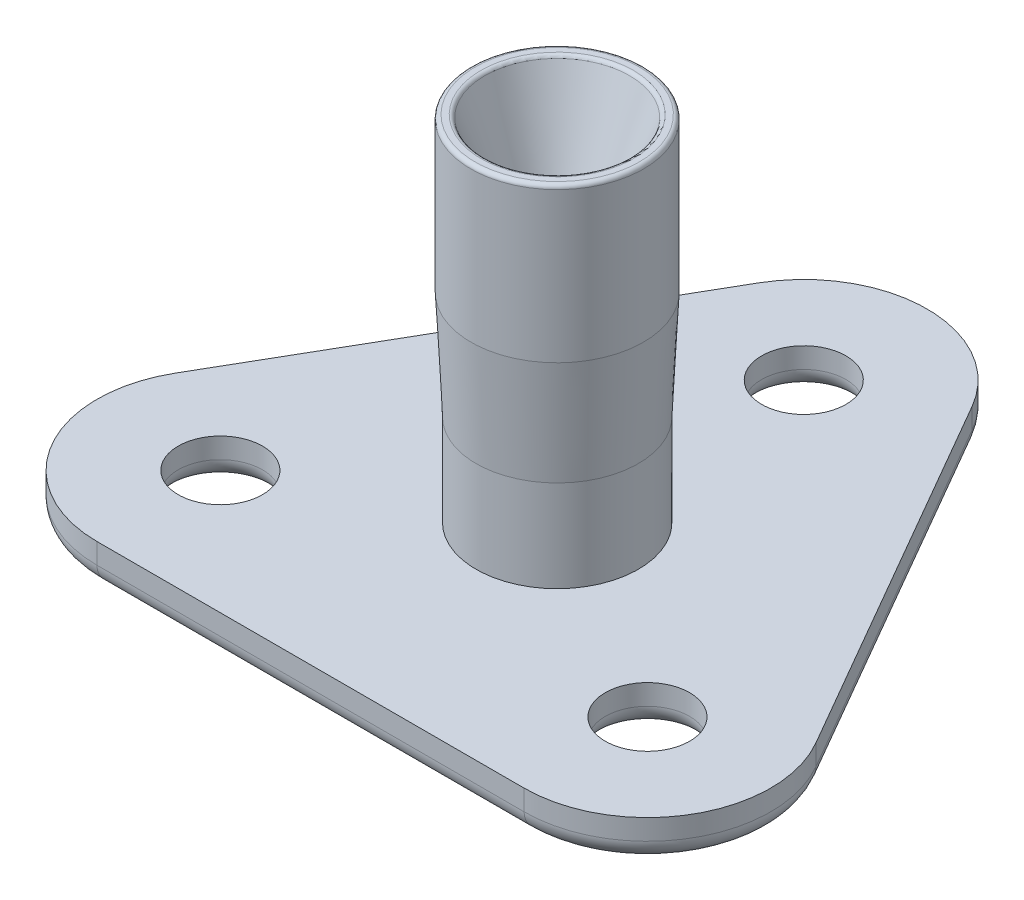
ISO-10303-21;
HEADER;
FILE_DESCRIPTION(('STEP AP214'),'2;1');
FILE_NAME('part.step','',(''),(''),'','','');
FILE_SCHEMA(('AUTOMOTIVE_DESIGN { 1 0 10303 214 1 1 1 1 }'));
ENDSEC;
DATA;
#1=APPLICATION_CONTEXT('core data for automotive mechanical design processes');
#2=APPLICATION_PROTOCOL_DEFINITION('international standard','automotive_design',2000,#1);
#3=PRODUCT_CONTEXT('',#1,'mechanical');
#4=PRODUCT('Part','Part','',(#3));
#5=PRODUCT_RELATED_PRODUCT_CATEGORY('part','',(#4));
#6=PRODUCT_DEFINITION_FORMATION('','',#4);
#7=PRODUCT_DEFINITION_CONTEXT('part definition',#1,'design');
#8=PRODUCT_DEFINITION('design','',#6,#7);
#9=PRODUCT_DEFINITION_SHAPE('','',#8);
#10=(LENGTH_UNIT() NAMED_UNIT(*) SI_UNIT(.MILLI.,.METRE.));
#11=(NAMED_UNIT(*) PLANE_ANGLE_UNIT() SI_UNIT($,.RADIAN.));
#12=(NAMED_UNIT(*) SI_UNIT($,.STERADIAN.) SOLID_ANGLE_UNIT());
#13=UNCERTAINTY_MEASURE_WITH_UNIT(LENGTH_MEASURE(1.E-05),#10,'distance_accuracy_value','');
#14=(GEOMETRIC_REPRESENTATION_CONTEXT(3) GLOBAL_UNCERTAINTY_ASSIGNED_CONTEXT((#13)) GLOBAL_UNIT_ASSIGNED_CONTEXT((#10,
#11,#12)) REPRESENTATION_CONTEXT('',''));
#15=CARTESIAN_POINT('',(0.,0.,0.));
#16=DIRECTION('',(0.,0.,1.));
#17=DIRECTION('',(1.,0.,0.));
#18=AXIS2_PLACEMENT_3D('',#15,#16,#17);
#19=CARTESIAN_POINT('',(0.,12.2419219804393,0.));
#20=DIRECTION('',(0.,1.,0.));
#21=DIRECTION('',(0.,0.,1.));
#22=AXIS2_PLACEMENT_3D('',#19,#20,#21);
#23=CONICAL_SURFACE('',#22,1.05,0.348575384764625);
#24=CARTESIAN_POINT('',(0.,19.0624665576369,0.));
#25=DIRECTION('',(0.,-1.,0.));
#26=DIRECTION('',(0.,0.,-1.));
#27=AXIS2_PLACEMENT_3D('',#24,#25,#26);
#28=CIRCLE('',#27,3.52868748193245);
#29=CARTESIAN_POINT('',(0.,19.0624665576369,3.52868748193245));
#30=VERTEX_POINT('',#29);
#31=EDGE_CURVE('E175',#30,#30,#28,.F.);
#32=CARTESIAN_POINT('',(0.,12.2419219804393,0.));
#33=DIRECTION('',(0.,-1.,0.));
#34=DIRECTION('',(0.,0.,-1.));
#35=AXIS2_PLACEMENT_3D('',#32,#33,#34);
#36=CIRCLE('',#35,1.05);
#37=CARTESIAN_POINT('',(0.,12.2419219804393,1.05));
#38=VERTEX_POINT('',#37);
#39=EDGE_CURVE('E154',#38,#38,#36,.T.);
#40=CARTESIAN_POINT('',(0.,19.0624665576369,3.52868748193245));
#41=CARTESIAN_POINT('',(0.,18.9914192182911,3.50286782066232));
#42=CARTESIAN_POINT('',(0.,18.9203718789453,3.47704815939219));
#43=CARTESIAN_POINT('',(0.,18.7782772002537,3.42540883685193));
#44=CARTESIAN_POINT('',(0.,18.7072298609079,3.3995891755818));
#45=CARTESIAN_POINT('',(0.,18.5651351822163,3.34794985304154));
#46=CARTESIAN_POINT('',(0.,18.4940878428705,3.32213019177141));
#47=CARTESIAN_POINT('',(0.,18.3519931641789,3.27049086923115));
#48=CARTESIAN_POINT('',(0.,18.280945824833,3.24467120796102));
#49=CARTESIAN_POINT('',(0.,18.1388511461414,3.19303188542076));
#50=CARTESIAN_POINT('',(0.,18.0678038067956,3.16721222415063));
#51=CARTESIAN_POINT('',(0.,17.925709128104,3.11557290161037));
#52=CARTESIAN_POINT('',(0.,17.8546617887582,3.08975324034024));
#53=CARTESIAN_POINT('',(0.,17.7125671100666,3.03811391779998));
#54=CARTESIAN_POINT('',(0.,17.6415197707208,3.01229425652986));
#55=CARTESIAN_POINT('',(0.,17.4994250920291,2.9606549339896));
#56=CARTESIAN_POINT('',(0.,17.4283777526833,2.93483527271947));
#57=CARTESIAN_POINT('',(0.,17.2862830739917,2.88319595017921));
#58=CARTESIAN_POINT('',(0.,17.2152357346459,2.85737628890908));
#59=CARTESIAN_POINT('',(0.,17.0731410559543,2.80573696636882));
#60=CARTESIAN_POINT('',(0.,17.0020937166085,2.77991730509869));
#61=CARTESIAN_POINT('',(0.,16.8599990379169,2.72827798255843));
#62=CARTESIAN_POINT('',(0.,16.788951698571,2.7024583212883));
#63=CARTESIAN_POINT('',(0.,16.6468570198794,2.65081899874804));
#64=CARTESIAN_POINT('',(0.,16.5758096805336,2.62499933747791));
#65=CARTESIAN_POINT('',(0.,16.433715001842,2.57336001493765));
#66=CARTESIAN_POINT('',(0.,16.3626676624962,2.54754035366752));
#67=CARTESIAN_POINT('',(0.,16.2205729838046,2.49590103112726));
#68=CARTESIAN_POINT('',(0.,16.1495256444588,2.47008136985713));
#69=CARTESIAN_POINT('',(0.,16.0074309657671,2.41844204731687));
#70=CARTESIAN_POINT('',(0.,15.9363836264213,2.39262238604674));
#71=CARTESIAN_POINT('',(0.,15.7942889477297,2.34098306350648));
#72=CARTESIAN_POINT('',(0.,15.7232416083839,2.31516340223635));
#73=CARTESIAN_POINT('',(0.,15.5811469296923,2.26352407969609));
#74=CARTESIAN_POINT('',(0.,15.5100995903465,2.23770441842597));
#75=CARTESIAN_POINT('',(0.,15.3680049116549,2.18606509588571));
#76=CARTESIAN_POINT('',(0.,15.2969575723091,2.16024543461558));
#77=CARTESIAN_POINT('',(0.,15.1548628936174,2.10860611207532));
#78=CARTESIAN_POINT('',(0.,15.0838155542716,2.08278645080519));
#79=CARTESIAN_POINT('',(0.,14.94172087558,2.03114712826493));
#80=CARTESIAN_POINT('',(0.,14.8706735362342,2.0053274669948));
#81=CARTESIAN_POINT('',(0.,14.7285788575426,1.95368814445454));
#82=CARTESIAN_POINT('',(0.,14.6575315181968,1.92786848318441));
#83=CARTESIAN_POINT('',(0.,14.5154368395052,1.87622916064415));
#84=CARTESIAN_POINT('',(0.,14.4443895001593,1.85040949937402));
#85=CARTESIAN_POINT('',(0.,14.3022948214677,1.79877017683376));
#86=CARTESIAN_POINT('',(0.,14.2312474821219,1.77295051556363));
#87=CARTESIAN_POINT('',(0.,14.0891528034303,1.72131119302337));
#88=CARTESIAN_POINT('',(0.,14.0181054640845,1.69549153175324));
#89=CARTESIAN_POINT('',(0.,13.8760107853929,1.64385220921298));
#90=CARTESIAN_POINT('',(0.,13.8049634460471,1.61803254794285));
#91=CARTESIAN_POINT('',(0.,13.6628687673554,1.56639322540259));
#92=CARTESIAN_POINT('',(0.,13.5918214280096,1.54057356413246));
#93=CARTESIAN_POINT('',(0.,13.449726749318,1.4889342415922));
#94=CARTESIAN_POINT('',(0.,13.3786794099722,1.46311458032208));
#95=CARTESIAN_POINT('',(0.,13.2365847312806,1.41147525778182));
#96=CARTESIAN_POINT('',(0.,13.1655373919348,1.38565559651169));
#97=CARTESIAN_POINT('',(0.,13.0234427132432,1.33401627397143));
#98=CARTESIAN_POINT('',(0.,12.9523953738973,1.3081966127013));
#99=CARTESIAN_POINT('',(0.,12.8103006952057,1.25655729016104));
#100=CARTESIAN_POINT('',(0.,12.7392533558599,1.23073762889091));
#101=CARTESIAN_POINT('',(0.,12.5971586771683,1.17909830635065));
#102=CARTESIAN_POINT('',(0.,12.5261113378225,1.15327864508052));
#103=CARTESIAN_POINT('',(0.,12.3840166591309,1.10163932254026));
#104=CARTESIAN_POINT('',(0.,12.3129693197851,1.07581966127013));
#105=CARTESIAN_POINT('',(0.,12.2419219804393,1.05));
#106=B_SPLINE_CURVE_WITH_KNOTS('',3,(#40,#41,#42,#43,#44,#45,#46,#47,#48,#49,#50,#51,#52,#53,
#54,#55,#56,#57,#58,#59,#60,#61,#62,#63,#64,#65,#66,#67,#68,#69,#70,#71,#72,#73,#74,#75,#76,#77,
#78,#79,#80,#81,#82,#83,#84,#85,#86,#87,#88,#89,#90,#91,#92,#93,#94,#95,#96,#97,#98,#99,#100,
#101,#102,#103,#104,#105),.UNSPECIFIED.,.F.,.F.,(4,2,2,2,2,2,2,2,2,2,2,2,2,2,2,2,2,2,2,2,2,2,2,
2,2,2,2,2,2,2,2,2,4),(0.,0.226780541550646,0.453561083101295,0.680341624651944,0.90712216620259,
1.13390270775324,1.36068324930389,1.58746379085454,1.81424433240519,2.04102487395583,
2.26780541550648,2.49458595705713,2.72136649860778,2.94814704015843,3.17492758170907,
3.40170812325972,3.62848866481037,3.85526920636102,4.08204974791167,4.30883028946232,
4.53561083101296,4.76239137256361,4.98917191411426,5.21595245566491,5.44273299721556,
5.66951353876621,5.89629408031685,6.1230746218675,6.34985516341815,6.5766357049688,
6.80341624651945,7.0301967880701,7.25697732962074),.UNSPECIFIED.);
#107=EDGE_CURVE('BSEAM35',#30,#38,#106,.T.);
#108=ORIENTED_EDGE('',*,*,#31,.T.);
#109=ORIENTED_EDGE('',*,*,#39,.T.);
#110=ORIENTED_EDGE('',*,*,#107,.T.);
#111=ORIENTED_EDGE('',*,*,#107,.F.);
#112=EDGE_LOOP('',(#108,#110,#109,#111));
#113=FACE_BOUND('',#112,.T.);
#114=ADVANCED_FACE('F35',(#113),#23,.F.);
#115=CARTESIAN_POINT('',(0.,19.1941547145831,0.));
#116=DIRECTION('',(0.,-1.,0.));
#117=DIRECTION('',(0.,0.,-1.));
#118=AXIS2_PLACEMENT_3D('',#115,#116,#117);
#119=PLANE('',#118);
#120=CARTESIAN_POINT('',(0.,19.1941547145831,0.));
#121=DIRECTION('',(0.,-1.,0.));
#122=DIRECTION('',(0.,0.,-1.));
#123=AXIS2_PLACEMENT_3D('',#120,#121,#122);
#124=CIRCLE('',#123,3.71665953330867);
#125=CARTESIAN_POINT('',(0.,19.1941547145831,-3.71665953330867));
#126=VERTEX_POINT('',#125);
#127=EDGE_CURVE('E172',#126,#126,#124,.T.);
#128=ORIENTED_EDGE('',*,*,#127,.T.);
#129=EDGE_LOOP('',(#128));
#130=FACE_BOUND('',#129,.T.);
#131=CARTESIAN_POINT('',(0.,19.1941547145831,0.));
#132=DIRECTION('',(0.,-1.,0.));
#133=DIRECTION('',(0.,0.,-1.));
#134=AXIS2_PLACEMENT_3D('',#131,#132,#133);
#135=CIRCLE('',#134,4.);
#136=CARTESIAN_POINT('',(0.,19.1941547145831,-4.));
#137=VERTEX_POINT('',#136);
#138=EDGE_CURVE('E169',#137,#137,#135,.F.);
#139=ORIENTED_EDGE('',*,*,#138,.T.);
#140=EDGE_LOOP('',(#139));
#141=FACE_BOUND('',#140,.T.);
#142=ADVANCED_FACE('F292',(#130,#141),#119,.F.);
#143=CARTESIAN_POINT('',(0.,0.,0.));
#144=DIRECTION('',(0.,-1.,0.));
#145=DIRECTION('',(0.,0.,-1.));
#146=AXIS2_PLACEMENT_3D('',#143,#144,#145);
#147=CYLINDRICAL_SURFACE('',#146,4.2);
#148=CARTESIAN_POINT('',(0.,18.9941547145831,0.));
#149=DIRECTION('',(0.,-1.,0.));
#150=DIRECTION('',(0.,0.,-1.));
#151=AXIS2_PLACEMENT_3D('',#148,#149,#150);
#152=CIRCLE('',#151,4.2);
#153=CARTESIAN_POINT('',(0.,18.9941547145831,-4.2));
#154=VERTEX_POINT('',#153);
#155=EDGE_CURVE('E178',#154,#154,#152,.T.);
#156=ORIENTED_EDGE('',*,*,#155,.T.);
#157=EDGE_LOOP('',(#156));
#158=FACE_BOUND('',#157,.T.);
#159=CARTESIAN_POINT('',(0.,11.6976685572823,0.));
#160=DIRECTION('',(0.,-1.,0.));
#161=DIRECTION('',(0.,0.,-1.));
#162=AXIS2_PLACEMENT_3D('',#159,#160,#161);
#163=CIRCLE('',#162,4.2);
#164=CARTESIAN_POINT('',(0.,11.6976685572823,-4.2));
#165=VERTEX_POINT('',#164);
#166=EDGE_CURVE('E166',#165,#165,#163,.T.);
#167=ORIENTED_EDGE('',*,*,#166,.F.);
#168=EDGE_LOOP('',(#167));
#169=FACE_BOUND('',#168,.T.);
#170=ADVANCED_FACE('F298',(#158,#169),#147,.T.);
#171=CARTESIAN_POINT('',(0.,11.6976685572823,0.));
#172=DIRECTION('',(0.,1.,0.));
#173=DIRECTION('',(0.,0.,1.));
#174=AXIS2_PLACEMENT_3D('',#171,#172,#173);
#175=CONICAL_SURFACE('',#174,4.2,0.0476505137092266);
#176=CARTESIAN_POINT('',(0.,6.45510688022455,0.));
#177=DIRECTION('',(0.,-1.,0.));
#178=DIRECTION('',(0.,0.,-1.));
#179=AXIS2_PLACEMENT_3D('',#176,#177,#178);
#180=CIRCLE('',#179,3.95);
#181=CARTESIAN_POINT('',(0.,6.45510688022455,-3.95));
#182=VERTEX_POINT('',#181);
#183=EDGE_CURVE('E163',#182,#182,#180,.T.);
#184=ORIENTED_EDGE('',*,*,#183,.F.);
#185=EDGE_LOOP('',(#184));
#186=FACE_BOUND('',#185,.T.);
#187=ORIENTED_EDGE('',*,*,#166,.T.);
#188=EDGE_LOOP('',(#187));
#189=FACE_BOUND('',#188,.T.);
#190=ADVANCED_FACE('F531',(#186,#189),#175,.T.);
#191=CARTESIAN_POINT('',(0.,0.,0.));
#192=DIRECTION('',(0.,-1.,0.));
#193=DIRECTION('',(0.,0.,-1.));
#194=AXIS2_PLACEMENT_3D('',#191,#192,#193);
#195=CYLINDRICAL_SURFACE('',#194,3.95);
#196=CARTESIAN_POINT('',(0.,2.,0.));
#197=DIRECTION('',(0.,-1.,0.));
#198=DIRECTION('',(0.,0.,-1.));
#199=AXIS2_PLACEMENT_3D('',#196,#197,#198);
#200=CIRCLE('',#199,3.95);
#201=CARTESIAN_POINT('',(0.,2.,-3.95));
#202=VERTEX_POINT('',#201);
#203=EDGE_CURVE('E160',#202,#202,#200,.T.);
#204=ORIENTED_EDGE('',*,*,#203,.F.);
#205=EDGE_LOOP('',(#204));
#206=FACE_BOUND('',#205,.T.);
#207=ORIENTED_EDGE('',*,*,#183,.T.);
#208=EDGE_LOOP('',(#207));
#209=FACE_BOUND('',#208,.T.);
#210=ADVANCED_FACE('F507',(#206,#209),#195,.T.);
#211=CARTESIAN_POINT('',(0.,2.,0.));
#212=DIRECTION('',(0.,-1.,0.));
#213=DIRECTION('',(0.,0.,-1.));
#214=AXIS2_PLACEMENT_3D('',#211,#212,#213);
#215=PLANE('',#214);
#216=ORIENTED_EDGE('',*,*,#203,.T.);
#217=EDGE_LOOP('',(#216));
#218=FACE_BOUND('',#217,.T.);
#219=CARTESIAN_POINT('',(10.3923048454133,2.,6.));
#220=DIRECTION('',(0.,-1.,0.));
#221=DIRECTION('',(0.,0.,-1.));
#222=AXIS2_PLACEMENT_3D('',#219,#220,#221);
#223=CIRCLE('',#222,2.05000000000005);
#224=CARTESIAN_POINT('',(10.3923048454133,2.,3.94999999999995));
#225=VERTEX_POINT('',#224);
#226=EDGE_CURVE('E269',#225,#225,#223,.T.);
#227=ORIENTED_EDGE('',*,*,#226,.T.);
#228=EDGE_LOOP('',(#227));
#229=FACE_BOUND('',#228,.T.);
#230=CARTESIAN_POINT('',(0.,2.,-12.));
#231=DIRECTION('',(0.,-1.,0.));
#232=DIRECTION('',(0.,0.,-1.));
#233=AXIS2_PLACEMENT_3D('',#230,#231,#232);
#234=CIRCLE('',#233,2.05);
#235=CARTESIAN_POINT('',(0.,2.,-14.05));
#236=VERTEX_POINT('',#235);
#237=EDGE_CURVE('E121',#236,#236,#234,.T.);
#238=ORIENTED_EDGE('',*,*,#237,.T.);
#239=EDGE_LOOP('',(#238));
#240=FACE_BOUND('',#239,.T.);
#241=DIRECTION('',(-0.500000000000005,0.,0.866025403784436));
#242=VECTOR('',#241,1.);
#243=CARTESIAN_POINT('',(-10.3923048454133,2.,-6.00000000000008));
#244=LINE('',#243,#242);
#245=CARTESIAN_POINT('',(-5.19615242270661,2.,-15.));
#246=VERTEX_POINT('',#245);
#247=CARTESIAN_POINT('',(-15.58845726812,2.,2.99999999999993));
#248=VERTEX_POINT('',#247);
#249=EDGE_CURVE('E110',#246,#248,#244,.T.);
#250=ORIENTED_EDGE('',*,*,#249,.T.);
#251=CARTESIAN_POINT('',(-10.3923048454133,2.,6.));
#252=DIRECTION('',(0.,-1.,0.));
#253=DIRECTION('',(0.,0.,-1.));
#254=AXIS2_PLACEMENT_3D('',#251,#252,#253);
#255=CIRCLE('',#254,6.00000000000011);
#256=CARTESIAN_POINT('',(-10.3923048454133,2.,12.));
#257=VERTEX_POINT('',#256);
#258=EDGE_CURVE('E115',#257,#248,#255,.T.);
#259=ORIENTED_EDGE('',*,*,#258,.F.);
#260=DIRECTION('',(-1.,0.,0.));
#261=VECTOR('',#260,1.);
#262=CARTESIAN_POINT('',(0.,2.,12.));
#263=LINE('',#262,#261);
#264=CARTESIAN_POINT('',(10.3923048454133,2.,12.0000000000001));
#265=VERTEX_POINT('',#264);
#266=EDGE_CURVE('E130',#265,#257,#263,.T.);
#267=ORIENTED_EDGE('',*,*,#266,.F.);
#268=CARTESIAN_POINT('',(10.3923048454133,2.,6.));
#269=DIRECTION('',(0.,-1.,0.));
#270=DIRECTION('',(0.,0.,-1.));
#271=AXIS2_PLACEMENT_3D('',#268,#269,#270);
#272=CIRCLE('',#271,6.00000000000005);
#273=CARTESIAN_POINT('',(15.5884572681199,2.,2.99999999999997));
#274=VERTEX_POINT('',#273);
#275=EDGE_CURVE('E142',#274,#265,#272,.T.);
#276=ORIENTED_EDGE('',*,*,#275,.F.);
#277=DIRECTION('',(0.500000000000002,0.,0.866025403784438));
#278=VECTOR('',#277,1.);
#279=CARTESIAN_POINT('',(10.3923048454133,2.,-6.00000000000003));
#280=LINE('',#279,#278);
#281=CARTESIAN_POINT('',(5.19615242270662,2.,-15.));
#282=VERTEX_POINT('',#281);
#283=EDGE_CURVE('E146',#282,#274,#280,.T.);
#284=ORIENTED_EDGE('',*,*,#283,.F.);
#285=CARTESIAN_POINT('',(0.,2.,-12.));
#286=DIRECTION('',(0.,-1.,0.));
#287=DIRECTION('',(0.,0.,-1.));
#288=AXIS2_PLACEMENT_3D('',#285,#286,#287);
#289=CIRCLE('',#288,6.);
#290=EDGE_CURVE('E118',#246,#282,#289,.T.);
#291=ORIENTED_EDGE('',*,*,#290,.F.);
#292=EDGE_LOOP('',(#250,#259,#267,#276,#284,#291));
#293=FACE_BOUND('',#292,.T.);
#294=CARTESIAN_POINT('',(-10.3923048454133,2.,6.));
#295=DIRECTION('',(0.,-1.,0.));
#296=DIRECTION('',(0.,0.,-1.));
#297=AXIS2_PLACEMENT_3D('',#294,#295,#296);
#298=CIRCLE('',#297,2.0500000000001);
#299=CARTESIAN_POINT('',(-10.3923048454133,2.,3.9499999999999));
#300=VERTEX_POINT('',#299);
#301=EDGE_CURVE('E120',#300,#300,#298,.T.);
#302=ORIENTED_EDGE('',*,*,#301,.T.);
#303=EDGE_LOOP('',(#302));
#304=FACE_BOUND('',#303,.T.);
#305=ADVANCED_FACE('F112',(#218,#229,#240,#293,#304),#215,.F.);
#306=CARTESIAN_POINT('',(0.,0.,0.));
#307=DIRECTION('',(0.,1.,0.));
#308=DIRECTION('',(0.,0.,1.));
#309=AXIS2_PLACEMENT_3D('',#306,#307,#308);
#310=PLANE('',#309);
#311=CARTESIAN_POINT('',(-10.3923048454133,0.,6.));
#312=DIRECTION('',(0.,1.,0.));
#313=DIRECTION('',(0.,0.,1.));
#314=AXIS2_PLACEMENT_3D('',#311,#312,#313);
#315=CIRCLE('',#314,3.0500000000001);
#316=CARTESIAN_POINT('',(-10.3923048454133,0.,9.05000000000011));
#317=VERTEX_POINT('',#316);
#318=EDGE_CURVE('E203',#317,#317,#315,.T.);
#319=ORIENTED_EDGE('',*,*,#318,.T.);
#320=EDGE_LOOP('',(#319));
#321=FACE_BOUND('',#320,.T.);
#322=CARTESIAN_POINT('',(10.3923048454133,0.,6.));
#323=DIRECTION('',(0.,1.,0.));
#324=DIRECTION('',(0.,0.,1.));
#325=AXIS2_PLACEMENT_3D('',#322,#323,#324);
#326=CIRCLE('',#325,3.05000000000005);
#327=CARTESIAN_POINT('',(10.3923048454133,0.,9.05000000000005));
#328=VERTEX_POINT('',#327);
#329=EDGE_CURVE('E200',#328,#328,#326,.T.);
#330=ORIENTED_EDGE('',*,*,#329,.T.);
#331=EDGE_LOOP('',(#330));
#332=FACE_BOUND('',#331,.T.);
#333=CARTESIAN_POINT('',(0.,0.,-12.));
#334=DIRECTION('',(0.,1.,0.));
#335=DIRECTION('',(0.,0.,1.));
#336=AXIS2_PLACEMENT_3D('',#333,#334,#335);
#337=CIRCLE('',#336,3.05);
#338=CARTESIAN_POINT('',(0.,0.,-8.95));
#339=VERTEX_POINT('',#338);
#340=EDGE_CURVE('E197',#339,#339,#337,.T.);
#341=ORIENTED_EDGE('',*,*,#340,.T.);
#342=EDGE_LOOP('',(#341));
#343=FACE_BOUND('',#342,.T.);
#344=DIRECTION('',(1.,0.,0.));
#345=VECTOR('',#344,1.);
#346=CARTESIAN_POINT('',(0.,0.,11.));
#347=LINE('',#346,#345);
#348=CARTESIAN_POINT('',(10.3923048454133,0.,11.0000000000001));
#349=VERTEX_POINT('',#348);
#350=CARTESIAN_POINT('',(-10.3923048454133,0.,11.));
#351=VERTEX_POINT('',#350);
#352=EDGE_CURVE('E192',#349,#351,#347,.F.);
#353=ORIENTED_EDGE('',*,*,#352,.T.);
#354=CARTESIAN_POINT('',(-10.3923048454133,0.,6.));
#355=DIRECTION('',(0.,1.,0.));
#356=DIRECTION('',(0.,0.,1.));
#357=AXIS2_PLACEMENT_3D('',#354,#355,#356);
#358=CIRCLE('',#357,5.00000000000011);
#359=CARTESIAN_POINT('',(-14.7224318643355,0.,3.49999999999993));
#360=VERTEX_POINT('',#359);
#361=EDGE_CURVE('E194',#351,#360,#358,.F.);
#362=ORIENTED_EDGE('',*,*,#361,.T.);
#363=DIRECTION('',(0.500000000000005,0.,-0.866025403784436));
#364=VECTOR('',#363,1.);
#365=CARTESIAN_POINT('',(-4.33012701892218,0.,-14.5));
#366=LINE('',#365,#364);
#367=CARTESIAN_POINT('',(-4.33012701892218,0.,-14.5));
#368=VERTEX_POINT('',#367);
#369=EDGE_CURVE('E184',#360,#368,#366,.T.);
#370=ORIENTED_EDGE('',*,*,#369,.T.);
#371=CARTESIAN_POINT('',(0.,0.,-12.));
#372=DIRECTION('',(0.,1.,0.));
#373=DIRECTION('',(0.,0.,1.));
#374=AXIS2_PLACEMENT_3D('',#371,#372,#373);
#375=CIRCLE('',#374,5.);
#376=CARTESIAN_POINT('',(4.33012701892219,0.,-14.5));
#377=VERTEX_POINT('',#376);
#378=EDGE_CURVE('E186',#368,#377,#375,.F.);
#379=ORIENTED_EDGE('',*,*,#378,.T.);
#380=DIRECTION('',(-0.500000000000002,0.,-0.866025403784438));
#381=VECTOR('',#380,1.);
#382=CARTESIAN_POINT('',(9.52627944162883,0.,-5.50000000000003));
#383=LINE('',#382,#381);
#384=CARTESIAN_POINT('',(14.7224318643355,0.,3.49999999999997));
#385=VERTEX_POINT('',#384);
#386=EDGE_CURVE('E188',#377,#385,#383,.F.);
#387=ORIENTED_EDGE('',*,*,#386,.T.);
#388=CARTESIAN_POINT('',(10.3923048454133,0.,6.));
#389=DIRECTION('',(0.,1.,0.));
#390=DIRECTION('',(0.,0.,1.));
#391=AXIS2_PLACEMENT_3D('',#388,#389,#390);
#392=CIRCLE('',#391,5.00000000000005);
#393=EDGE_CURVE('E190',#385,#349,#392,.F.);
#394=ORIENTED_EDGE('',*,*,#393,.T.);
#395=EDGE_LOOP('',(#353,#362,#370,#379,#387,#394));
#396=FACE_BOUND('',#395,.T.);
#397=CARTESIAN_POINT('',(0.,0.,0.));
#398=DIRECTION('',(0.,1.,0.));
#399=DIRECTION('',(0.,0.,1.));
#400=AXIS2_PLACEMENT_3D('',#397,#398,#399);
#401=CIRCLE('',#400,3.25981112563822);
#402=CARTESIAN_POINT('',(0.,0.,3.25981112563822));
#403=VERTEX_POINT('',#402);
#404=EDGE_CURVE('E181',#403,#403,#401,.T.);
#405=ORIENTED_EDGE('',*,*,#404,.T.);
#406=EDGE_LOOP('',(#405));
#407=FACE_BOUND('',#406,.T.);
#408=ADVANCED_FACE('F249',(#321,#332,#343,#396,#407),#310,.F.);
#409=CARTESIAN_POINT('',(0.,0.,0.));
#410=DIRECTION('',(0.,-1.,0.));
#411=DIRECTION('',(0.,0.,-1.));
#412=AXIS2_PLACEMENT_3D('',#409,#410,#411);
#413=CONICAL_SURFACE('',#412,2.8072837632777,0.72088893930575);
#414=CARTESIAN_POINT('',(0.,0.339947278980805,0.));
#415=DIRECTION('',(0.,1.,0.));
#416=DIRECTION('',(0.,0.,1.));
#417=AXIS2_PLACEMENT_3D('',#414,#415,#416);
#418=CIRCLE('',#417,2.508591846416);
#419=CARTESIAN_POINT('',(0.,0.339947278980805,2.508591846416));
#420=VERTEX_POINT('',#419);
#421=EDGE_CURVE('E11',#420,#420,#418,.F.);
#422=ORIENTED_EDGE('',*,*,#421,.T.);
#423=EDGE_LOOP('',(#422));
#424=FACE_BOUND('',#423,.T.);
#425=CARTESIAN_POINT('',(0.,2.,0.));
#426=DIRECTION('',(0.,-1.,0.));
#427=DIRECTION('',(0.,0.,-1.));
#428=AXIS2_PLACEMENT_3D('',#425,#426,#427);
#429=CIRCLE('',#428,1.05);
#430=CARTESIAN_POINT('',(0.,2.,-1.05));
#431=VERTEX_POINT('',#430);
#432=EDGE_CURVE('E157',#431,#431,#429,.T.);
#433=ORIENTED_EDGE('',*,*,#432,.F.);
#434=EDGE_LOOP('',(#433));
#435=FACE_BOUND('',#434,.T.);
#436=ADVANCED_FACE('F475',(#424,#435),#413,.F.);
#437=CARTESIAN_POINT('',(0.,0.,0.));
#438=DIRECTION('',(0.,-1.,0.));
#439=DIRECTION('',(0.,0.,-1.));
#440=AXIS2_PLACEMENT_3D('',#437,#438,#439);
#441=CYLINDRICAL_SURFACE('',#440,1.05);
#442=ORIENTED_EDGE('',*,*,#39,.F.);
#443=EDGE_LOOP('',(#442));
#444=FACE_BOUND('',#443,.T.);
#445=ORIENTED_EDGE('',*,*,#432,.T.);
#446=EDGE_LOOP('',(#445));
#447=FACE_BOUND('',#446,.T.);
#448=ADVANCED_FACE('F467',(#444,#447),#441,.F.);
#449=CARTESIAN_POINT('',(-10.3923048454133,46.4390665133715,-6.00000000000008));
#450=DIRECTION('',(-0.866025403784436,0.,-0.500000000000004));
#451=DIRECTION('',(-0.500000000000005,0.,0.866025403784436));
#452=AXIS2_PLACEMENT_3D('',#449,#450,#451);
#453=PLANE('',#452);
#454=DIRECTION('',(0.,-1.,0.));
#455=VECTOR('',#454,1.);
#456=CARTESIAN_POINT('',(-5.19615242270662,46.4390665133715,-15.));
#457=LINE('',#456,#455);
#458=CARTESIAN_POINT('',(-5.19615242270662,1.,-15.));
#459=VERTEX_POINT('',#458);
#460=EDGE_CURVE('E136',#246,#459,#457,.T.);
#461=ORIENTED_EDGE('',*,*,#460,.T.);
#462=DIRECTION('',(0.500000000000005,0.,-0.866025403784436));
#463=VECTOR('',#462,1.);
#464=CARTESIAN_POINT('',(-15.58845726812,1.,2.99999999999993));
#465=LINE('',#464,#463);
#466=CARTESIAN_POINT('',(-15.58845726812,1.,2.99999999999993));
#467=VERTEX_POINT('',#466);
#468=EDGE_CURVE('E44',#459,#467,#465,.F.);
#469=ORIENTED_EDGE('',*,*,#468,.T.);
#470=DIRECTION('',(0.,-1.,0.));
#471=VECTOR('',#470,1.);
#472=CARTESIAN_POINT('',(-15.58845726812,46.4390665133715,2.99999999999993));
#473=LINE('',#472,#471);
#474=EDGE_CURVE('E124',#248,#467,#473,.T.);
#475=ORIENTED_EDGE('',*,*,#474,.F.);
#476=ORIENTED_EDGE('',*,*,#249,.F.);
#477=EDGE_LOOP('',(#461,#469,#475,#476));
#478=FACE_BOUND('',#477,.T.);
#479=ADVANCED_FACE('F125',(#478),#453,.T.);
#480=CARTESIAN_POINT('',(-10.3923048454133,46.4390665133715,6.));
#481=DIRECTION('',(0.,-1.,0.));
#482=DIRECTION('',(0.,0.,-1.));
#483=AXIS2_PLACEMENT_3D('',#480,#481,#482);
#484=CYLINDRICAL_SURFACE('',#483,6.00000000000011);
#485=ORIENTED_EDGE('',*,*,#474,.T.);
#486=CARTESIAN_POINT('',(-10.3923048454133,1.,6.));
#487=DIRECTION('',(0.,1.,0.));
#488=DIRECTION('',(0.,0.,1.));
#489=AXIS2_PLACEMENT_3D('',#486,#487,#488);
#490=CIRCLE('',#489,6.00000000000011);
#491=CARTESIAN_POINT('',(-10.3923048454133,1.,12.0000000000001));
#492=VERTEX_POINT('',#491);
#493=EDGE_CURVE('E215',#467,#492,#490,.T.);
#494=ORIENTED_EDGE('',*,*,#493,.T.);
#495=DIRECTION('',(0.,-1.,0.));
#496=VECTOR('',#495,1.);
#497=CARTESIAN_POINT('',(-10.3923048454133,46.4390665133715,12.0000000000001));
#498=LINE('',#497,#496);
#499=EDGE_CURVE('E134',#257,#492,#498,.T.);
#500=ORIENTED_EDGE('',*,*,#499,.F.);
#501=ORIENTED_EDGE('',*,*,#258,.T.);
#502=EDGE_LOOP('',(#485,#494,#500,#501));
#503=FACE_BOUND('',#502,.T.);
#504=ADVANCED_FACE('F132',(#503),#484,.T.);
#505=CARTESIAN_POINT('',(0.,46.4390665133715,12.));
#506=DIRECTION('',(0.,0.,-1.));
#507=DIRECTION('',(-1.,0.,0.));
#508=AXIS2_PLACEMENT_3D('',#505,#506,#507);
#509=PLANE('',#508);
#510=ORIENTED_EDGE('',*,*,#499,.T.);
#511=DIRECTION('',(1.,0.,0.));
#512=VECTOR('',#511,1.);
#513=CARTESIAN_POINT('',(0.,1.,12.));
#514=LINE('',#513,#512);
#515=CARTESIAN_POINT('',(10.3923048454133,1.,12.));
#516=VERTEX_POINT('',#515);
#517=EDGE_CURVE('E217',#492,#516,#514,.T.);
#518=ORIENTED_EDGE('',*,*,#517,.T.);
#519=DIRECTION('',(0.,-1.,0.));
#520=VECTOR('',#519,1.);
#521=CARTESIAN_POINT('',(10.3923048454133,46.4390665133715,12.));
#522=LINE('',#521,#520);
#523=EDGE_CURVE('E145',#265,#516,#522,.T.);
#524=ORIENTED_EDGE('',*,*,#523,.F.);
#525=ORIENTED_EDGE('',*,*,#266,.T.);
#526=EDGE_LOOP('',(#510,#518,#524,#525));
#527=FACE_BOUND('',#526,.T.);
#528=ADVANCED_FACE('F262',(#527),#509,.F.);
#529=CARTESIAN_POINT('',(10.3923048454133,46.4390665133715,6.));
#530=DIRECTION('',(0.,-1.,0.));
#531=DIRECTION('',(0.,0.,-1.));
#532=AXIS2_PLACEMENT_3D('',#529,#530,#531);
#533=CYLINDRICAL_SURFACE('',#532,6.00000000000005);
#534=ORIENTED_EDGE('',*,*,#523,.T.);
#535=CARTESIAN_POINT('',(10.3923048454133,1.,6.));
#536=DIRECTION('',(0.,1.,0.));
#537=DIRECTION('',(0.,0.,1.));
#538=AXIS2_PLACEMENT_3D('',#535,#536,#537);
#539=CIRCLE('',#538,6.00000000000005);
#540=CARTESIAN_POINT('',(15.5884572681199,1.,2.99999999999997));
#541=VERTEX_POINT('',#540);
#542=EDGE_CURVE('E219',#516,#541,#539,.T.);
#543=ORIENTED_EDGE('',*,*,#542,.T.);
#544=DIRECTION('',(0.,-1.,0.));
#545=VECTOR('',#544,1.);
#546=CARTESIAN_POINT('',(15.5884572681199,46.4390665133715,2.99999999999997));
#547=LINE('',#546,#545);
#548=EDGE_CURVE('E149',#274,#541,#547,.T.);
#549=ORIENTED_EDGE('',*,*,#548,.F.);
#550=ORIENTED_EDGE('',*,*,#275,.T.);
#551=EDGE_LOOP('',(#534,#543,#549,#550));
#552=FACE_BOUND('',#551,.T.);
#553=ADVANCED_FACE('F437',(#552),#533,.T.);
#554=CARTESIAN_POINT('',(10.3923048454133,46.4390665133715,-6.00000000000003));
#555=DIRECTION('',(-0.866025403784438,0.,0.500000000000002));
#556=DIRECTION('',(0.500000000000002,0.,0.866025403784438));
#557=AXIS2_PLACEMENT_3D('',#554,#555,#556);
#558=PLANE('',#557);
#559=ORIENTED_EDGE('',*,*,#548,.T.);
#560=DIRECTION('',(-0.500000000000002,0.,-0.866025403784438));
#561=VECTOR('',#560,1.);
#562=CARTESIAN_POINT('',(10.3923048454133,1.,-6.00000000000003));
#563=LINE('',#562,#561);
#564=CARTESIAN_POINT('',(5.19615242270662,1.,-15.));
#565=VERTEX_POINT('',#564);
#566=EDGE_CURVE('E60',#541,#565,#563,.T.);
#567=ORIENTED_EDGE('',*,*,#566,.T.);
#568=DIRECTION('',(0.,-1.,0.));
#569=VECTOR('',#568,1.);
#570=CARTESIAN_POINT('',(5.19615242270662,46.4390665133715,-15.));
#571=LINE('',#570,#569);
#572=EDGE_CURVE('E151',#282,#565,#571,.T.);
#573=ORIENTED_EDGE('',*,*,#572,.F.);
#574=ORIENTED_EDGE('',*,*,#283,.T.);
#575=EDGE_LOOP('',(#559,#567,#573,#574));
#576=FACE_BOUND('',#575,.T.);
#577=ADVANCED_FACE('F288',(#576),#558,.F.);
#578=CARTESIAN_POINT('',(10.3923048454133,46.4390665133715,6.));
#579=DIRECTION('',(0.,-1.,0.));
#580=DIRECTION('',(0.,0.,-1.));
#581=AXIS2_PLACEMENT_3D('',#578,#579,#580);
#582=CYLINDRICAL_SURFACE('',#581,2.05000000000005);
#583=CARTESIAN_POINT('',(10.3923048454133,1.,6.));
#584=DIRECTION('',(0.,1.,0.));
#585=DIRECTION('',(0.,0.,1.));
#586=AXIS2_PLACEMENT_3D('',#583,#584,#585);
#587=CIRCLE('',#586,2.05000000000005);
#588=CARTESIAN_POINT('',(10.3923048454133,1.,8.05000000000005));
#589=VERTEX_POINT('',#588);
#590=EDGE_CURVE('E209',#589,#589,#587,.F.);
#591=ORIENTED_EDGE('',*,*,#590,.T.);
#592=EDGE_LOOP('',(#591));
#593=FACE_BOUND('',#592,.T.);
#594=ORIENTED_EDGE('',*,*,#226,.F.);
#595=EDGE_LOOP('',(#594));
#596=FACE_BOUND('',#595,.T.);
#597=ADVANCED_FACE('F279',(#593,#596),#582,.F.);
#598=CARTESIAN_POINT('',(0.,46.4390665133715,-12.));
#599=DIRECTION('',(0.,-1.,0.));
#600=DIRECTION('',(0.,0.,-1.));
#601=AXIS2_PLACEMENT_3D('',#598,#599,#600);
#602=CYLINDRICAL_SURFACE('',#601,2.05);
#603=CARTESIAN_POINT('',(0.,1.,-12.));
#604=DIRECTION('',(0.,1.,0.));
#605=DIRECTION('',(0.,0.,1.));
#606=AXIS2_PLACEMENT_3D('',#603,#604,#605);
#607=CIRCLE('',#606,2.05);
#608=CARTESIAN_POINT('',(0.,1.,-9.95));
#609=VERTEX_POINT('',#608);
#610=EDGE_CURVE('E212',#609,#609,#607,.F.);
#611=ORIENTED_EDGE('',*,*,#610,.T.);
#612=EDGE_LOOP('',(#611));
#613=FACE_BOUND('',#612,.T.);
#614=ORIENTED_EDGE('',*,*,#237,.F.);
#615=EDGE_LOOP('',(#614));
#616=FACE_BOUND('',#615,.T.);
#617=ADVANCED_FACE('F276',(#613,#616),#602,.F.);
#618=CARTESIAN_POINT('',(0.,46.4390665133715,-12.));
#619=DIRECTION('',(0.,-1.,0.));
#620=DIRECTION('',(0.,0.,-1.));
#621=AXIS2_PLACEMENT_3D('',#618,#619,#620);
#622=CYLINDRICAL_SURFACE('',#621,6.);
#623=ORIENTED_EDGE('',*,*,#572,.T.);
#624=CARTESIAN_POINT('',(0.,1.,-12.));
#625=DIRECTION('',(0.,1.,0.));
#626=DIRECTION('',(0.,0.,1.));
#627=AXIS2_PLACEMENT_3D('',#624,#625,#626);
#628=CIRCLE('',#627,6.);
#629=EDGE_CURVE('E52',#565,#459,#628,.T.);
#630=ORIENTED_EDGE('',*,*,#629,.T.);
#631=ORIENTED_EDGE('',*,*,#460,.F.);
#632=ORIENTED_EDGE('',*,*,#290,.T.);
#633=EDGE_LOOP('',(#623,#630,#631,#632));
#634=FACE_BOUND('',#633,.T.);
#635=ADVANCED_FACE('F278',(#634),#622,.T.);
#636=CARTESIAN_POINT('',(-10.3923048454133,46.4390665133715,6.));
#637=DIRECTION('',(0.,-1.,0.));
#638=DIRECTION('',(0.,0.,-1.));
#639=AXIS2_PLACEMENT_3D('',#636,#637,#638);
#640=CYLINDRICAL_SURFACE('',#639,2.0500000000001);
#641=CARTESIAN_POINT('',(-10.3923048454133,1.,6.));
#642=DIRECTION('',(0.,1.,0.));
#643=DIRECTION('',(0.,0.,1.));
#644=AXIS2_PLACEMENT_3D('',#641,#642,#643);
#645=CIRCLE('',#644,2.0500000000001);
#646=CARTESIAN_POINT('',(-10.3923048454133,1.,8.05000000000011));
#647=VERTEX_POINT('',#646);
#648=EDGE_CURVE('E206',#647,#647,#645,.F.);
#649=ORIENTED_EDGE('',*,*,#648,.T.);
#650=EDGE_LOOP('',(#649));
#651=FACE_BOUND('',#650,.T.);
#652=ORIENTED_EDGE('',*,*,#301,.F.);
#653=EDGE_LOOP('',(#652));
#654=FACE_BOUND('',#653,.T.);
#655=ADVANCED_FACE('F286',(#651,#654),#640,.F.);
#656=CARTESIAN_POINT('',(0.,18.9941547145831,0.));
#657=DIRECTION('',(0.,-1.,0.));
#658=DIRECTION('',(0.,0.,-1.));
#659=AXIS2_PLACEMENT_3D('',#656,#657,#658);
#660=TOROIDAL_SURFACE('',#659,3.71665953330867,0.2);
#661=ORIENTED_EDGE('',*,*,#31,.F.);
#662=EDGE_LOOP('',(#661));
#663=FACE_BOUND('',#662,.T.);
#664=ORIENTED_EDGE('',*,*,#127,.F.);
#665=EDGE_LOOP('',(#664));
#666=FACE_BOUND('',#665,.T.);
#667=ADVANCED_FACE('F304',(#663,#666),#660,.T.);
#668=CARTESIAN_POINT('',(0.,18.9941547145831,0.));
#669=DIRECTION('',(0.,-1.,0.));
#670=DIRECTION('',(0.,0.,-1.));
#671=AXIS2_PLACEMENT_3D('',#668,#669,#670);
#672=TOROIDAL_SURFACE('',#671,4.,0.2);
#673=ORIENTED_EDGE('',*,*,#138,.F.);
#674=EDGE_LOOP('',(#673));
#675=FACE_BOUND('',#674,.T.);
#676=ORIENTED_EDGE('',*,*,#155,.F.);
#677=EDGE_LOOP('',(#676));
#678=FACE_BOUND('',#677,.T.);
#679=ADVANCED_FACE('F307',(#675,#678),#672,.T.);
#680=CARTESIAN_POINT('',(-10.3923048454133,1.,6.));
#681=DIRECTION('',(0.,1.,0.));
#682=DIRECTION('',(0.,0.,1.));
#683=AXIS2_PLACEMENT_3D('',#680,#681,#682);
#684=TOROIDAL_SURFACE('',#683,3.0500000000001,1.);
#685=ORIENTED_EDGE('',*,*,#648,.F.);
#686=EDGE_LOOP('',(#685));
#687=FACE_BOUND('',#686,.T.);
#688=ORIENTED_EDGE('',*,*,#318,.F.);
#689=EDGE_LOOP('',(#688));
#690=FACE_BOUND('',#689,.T.);
#691=ADVANCED_FACE('F311',(#687,#690),#684,.T.);
#692=CARTESIAN_POINT('',(10.3923048454133,1.,6.));
#693=DIRECTION('',(0.,1.,0.));
#694=DIRECTION('',(0.,0.,1.));
#695=AXIS2_PLACEMENT_3D('',#692,#693,#694);
#696=TOROIDAL_SURFACE('',#695,3.05000000000005,1.);
#697=ORIENTED_EDGE('',*,*,#590,.F.);
#698=EDGE_LOOP('',(#697));
#699=FACE_BOUND('',#698,.T.);
#700=ORIENTED_EDGE('',*,*,#329,.F.);
#701=EDGE_LOOP('',(#700));
#702=FACE_BOUND('',#701,.T.);
#703=ADVANCED_FACE('F315',(#699,#702),#696,.T.);
#704=CARTESIAN_POINT('',(0.,1.,-12.));
#705=DIRECTION('',(0.,1.,0.));
#706=DIRECTION('',(0.,0.,1.));
#707=AXIS2_PLACEMENT_3D('',#704,#705,#706);
#708=TOROIDAL_SURFACE('',#707,3.05,1.);
#709=ORIENTED_EDGE('',*,*,#610,.F.);
#710=EDGE_LOOP('',(#709));
#711=FACE_BOUND('',#710,.T.);
#712=ORIENTED_EDGE('',*,*,#340,.F.);
#713=EDGE_LOOP('',(#712));
#714=FACE_BOUND('',#713,.T.);
#715=ADVANCED_FACE('F319',(#711,#714),#708,.T.);
#716=CARTESIAN_POINT('',(9.52627944162883,1.,-5.50000000000003));
#717=DIRECTION('',(-0.500000000000002,0.,-0.866025403784438));
#718=DIRECTION('',(-0.866025403784438,0.,0.500000000000002));
#719=AXIS2_PLACEMENT_3D('',#716,#717,#718);
#720=CYLINDRICAL_SURFACE('',#719,1.);
#721=CARTESIAN_POINT('',(14.7224318643355,1.,3.49999999999997));
#722=DIRECTION('',(0.500000000000002,0.,0.866025403784437));
#723=DIRECTION('',(0.866025403784437,0.,-0.500000000000002));
#724=AXIS2_PLACEMENT_3D('',#721,#722,#723);
#725=CIRCLE('',#724,1.);
#726=EDGE_CURVE('E233',#385,#541,#725,.T.);
#727=ORIENTED_EDGE('',*,*,#726,.F.);
#728=ORIENTED_EDGE('',*,*,#386,.F.);
#729=CARTESIAN_POINT('',(4.33012701892218,1.,-14.5));
#730=DIRECTION('',(-0.500000000000002,0.,-0.866025403784437));
#731=DIRECTION('',(-0.866025403784437,0.,0.500000000000002));
#732=AXIS2_PLACEMENT_3D('',#729,#730,#731);
#733=CIRCLE('',#732,1.);
#734=EDGE_CURVE('E39',#565,#377,#733,.T.);
#735=ORIENTED_EDGE('',*,*,#734,.F.);
#736=ORIENTED_EDGE('',*,*,#566,.F.);
#737=EDGE_LOOP('',(#727,#728,#735,#736));
#738=FACE_BOUND('',#737,.T.);
#739=ADVANCED_FACE('F247',(#738),#720,.T.);
#740=CARTESIAN_POINT('',(0.,1.,-12.));
#741=DIRECTION('',(0.,1.,0.));
#742=DIRECTION('',(0.,0.,1.));
#743=AXIS2_PLACEMENT_3D('',#740,#741,#742);
#744=TOROIDAL_SURFACE('',#743,5.,1.);
#745=ORIENTED_EDGE('',*,*,#734,.T.);
#746=ORIENTED_EDGE('',*,*,#378,.F.);
#747=CARTESIAN_POINT('',(-4.33012701892218,1.,-14.5));
#748=DIRECTION('',(-0.500000000000005,0.,0.866025403784436));
#749=DIRECTION('',(0.866025403784436,0.,0.500000000000005));
#750=AXIS2_PLACEMENT_3D('',#747,#748,#749);
#751=CIRCLE('',#750,1.);
#752=EDGE_CURVE('E231',#459,#368,#751,.T.);
#753=ORIENTED_EDGE('',*,*,#752,.F.);
#754=ORIENTED_EDGE('',*,*,#629,.F.);
#755=EDGE_LOOP('',(#745,#746,#753,#754));
#756=FACE_BOUND('',#755,.T.);
#757=ADVANCED_FACE('F243',(#756),#744,.T.);
#758=CARTESIAN_POINT('',(10.3923048454133,1.,6.));
#759=DIRECTION('',(0.,1.,0.));
#760=DIRECTION('',(0.,0.,1.));
#761=AXIS2_PLACEMENT_3D('',#758,#759,#760);
#762=TOROIDAL_SURFACE('',#761,5.00000000000005,1.);
#763=ORIENTED_EDGE('',*,*,#726,.T.);
#764=ORIENTED_EDGE('',*,*,#542,.F.);
#765=CARTESIAN_POINT('',(10.3923048454133,1.,11.0000000000001));
#766=DIRECTION('',(-1.,0.,0.));
#767=DIRECTION('',(0.,0.,1.));
#768=AXIS2_PLACEMENT_3D('',#765,#766,#767);
#769=CIRCLE('',#768,1.);
#770=EDGE_CURVE('E228',#349,#516,#769,.T.);
#771=ORIENTED_EDGE('',*,*,#770,.F.);
#772=ORIENTED_EDGE('',*,*,#393,.F.);
#773=EDGE_LOOP('',(#763,#764,#771,#772));
#774=FACE_BOUND('',#773,.T.);
#775=ADVANCED_FACE('F332',(#774),#762,.T.);
#776=CARTESIAN_POINT('',(-9.52627944162884,1.,-5.50000000000008));
#777=DIRECTION('',(-0.500000000000005,0.,0.866025403784436));
#778=DIRECTION('',(0.866025403784436,0.,0.500000000000005));
#779=AXIS2_PLACEMENT_3D('',#776,#777,#778);
#780=CYLINDRICAL_SURFACE('',#779,1.);
#781=ORIENTED_EDGE('',*,*,#752,.T.);
#782=ORIENTED_EDGE('',*,*,#369,.F.);
#783=CARTESIAN_POINT('',(-14.7224318643355,1.,3.49999999999993));
#784=DIRECTION('',(-0.500000000000005,0.,0.866025403784436));
#785=DIRECTION('',(0.866025403784436,0.,0.500000000000005));
#786=AXIS2_PLACEMENT_3D('',#783,#784,#785);
#787=CIRCLE('',#786,1.);
#788=EDGE_CURVE('E226',#467,#360,#787,.T.);
#789=ORIENTED_EDGE('',*,*,#788,.F.);
#790=ORIENTED_EDGE('',*,*,#468,.F.);
#791=EDGE_LOOP('',(#781,#782,#789,#790));
#792=FACE_BOUND('',#791,.T.);
#793=ADVANCED_FACE('F255',(#792),#780,.T.);
#794=CARTESIAN_POINT('',(0.,1.,11.));
#795=DIRECTION('',(1.,0.,0.));
#796=DIRECTION('',(0.,0.,-1.));
#797=AXIS2_PLACEMENT_3D('',#794,#795,#796);
#798=CYLINDRICAL_SURFACE('',#797,1.);
#799=ORIENTED_EDGE('',*,*,#770,.T.);
#800=ORIENTED_EDGE('',*,*,#517,.F.);
#801=CARTESIAN_POINT('',(-10.3923048454133,1.,11.));
#802=DIRECTION('',(-1.,0.,0.));
#803=DIRECTION('',(0.,0.,1.));
#804=AXIS2_PLACEMENT_3D('',#801,#802,#803);
#805=CIRCLE('',#804,1.);
#806=EDGE_CURVE('E224',#351,#492,#805,.T.);
#807=ORIENTED_EDGE('',*,*,#806,.F.);
#808=ORIENTED_EDGE('',*,*,#352,.F.);
#809=EDGE_LOOP('',(#799,#800,#807,#808));
#810=FACE_BOUND('',#809,.T.);
#811=ADVANCED_FACE('F326',(#810),#798,.T.);
#812=CARTESIAN_POINT('',(-10.3923048454133,1.,6.));
#813=DIRECTION('',(0.,1.,0.));
#814=DIRECTION('',(0.,0.,1.));
#815=AXIS2_PLACEMENT_3D('',#812,#813,#814);
#816=TOROIDAL_SURFACE('',#815,5.00000000000011,1.);
#817=ORIENTED_EDGE('',*,*,#788,.T.);
#818=ORIENTED_EDGE('',*,*,#361,.F.);
#819=ORIENTED_EDGE('',*,*,#806,.T.);
#820=ORIENTED_EDGE('',*,*,#493,.F.);
#821=EDGE_LOOP('',(#817,#818,#819,#820));
#822=FACE_BOUND('',#821,.T.);
#823=ADVANCED_FACE('F258',(#822),#816,.T.);
#824=CARTESIAN_POINT('',(0.,1.,0.));
#825=DIRECTION('',(0.,1.,0.));
#826=DIRECTION('',(0.,0.,1.));
#827=AXIS2_PLACEMENT_3D('',#824,#825,#826);
#828=TOROIDAL_SURFACE('',#827,3.25981112563822,1.);
#829=ORIENTED_EDGE('',*,*,#404,.F.);
#830=EDGE_LOOP('',(#829));
#831=FACE_BOUND('',#830,.T.);
#832=ORIENTED_EDGE('',*,*,#421,.F.);
#833=EDGE_LOOP('',(#832));
#834=FACE_BOUND('',#833,.T.);
#835=ADVANCED_FACE('F37',(#831,#834),#828,.T.);
#836=CLOSED_SHELL('',(#114,#142,#170,#190,#210,#305,#408,#436,#448,#479,#504,#528,#553,#577,
#597,#617,#635,#655,#667,#679,#691,#703,#715,#739,#757,#775,#793,#811,#823,#835));
#837=MANIFOLD_SOLID_BREP('B2',#836);
#838=ADVANCED_BREP_SHAPE_REPRESENTATION('',(#18,#837),#14);
#839=SHAPE_DEFINITION_REPRESENTATION(#9,#838);
ENDSEC;
END-ISO-10303-21;
